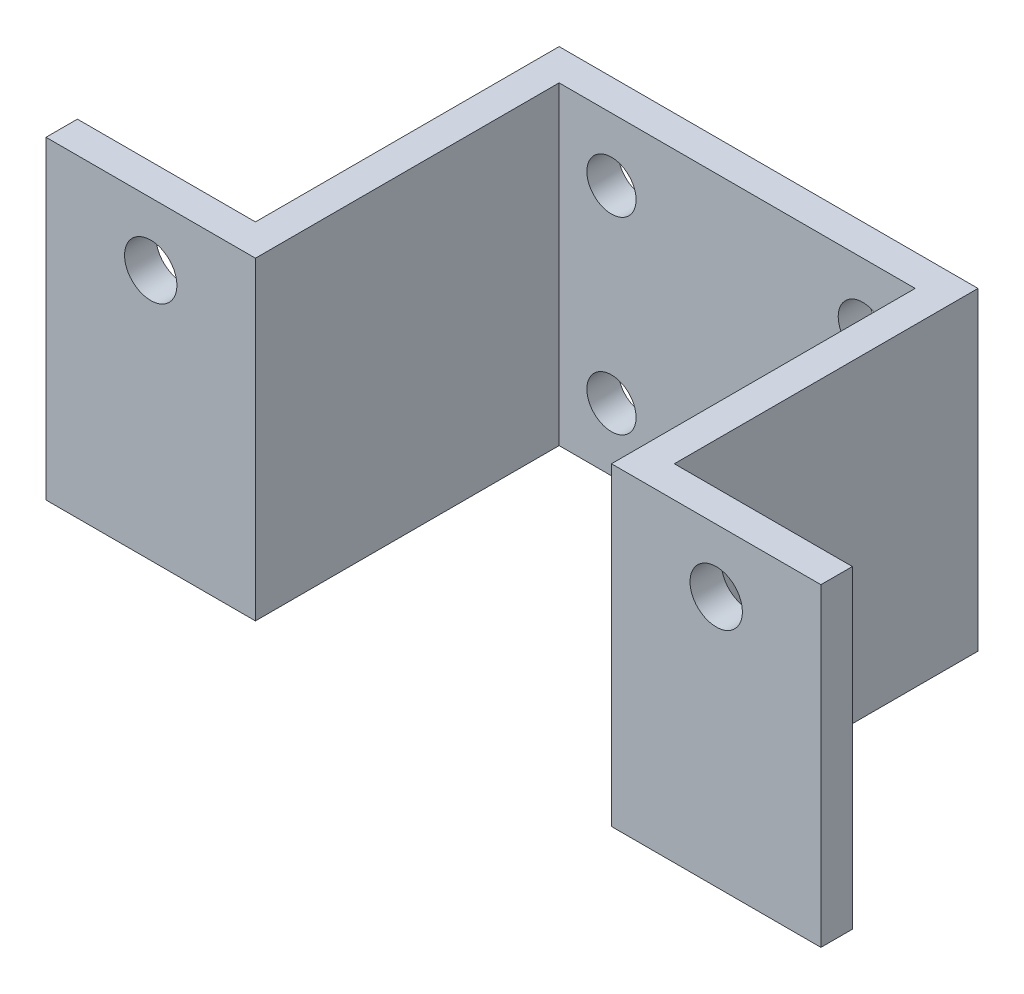
ISO-10303-21;
HEADER;
FILE_DESCRIPTION(('STEP AP214'),'2;1');
FILE_NAME('part.step','',(''),(''),'','','');
FILE_SCHEMA(('AUTOMOTIVE_DESIGN { 1 0 10303 214 1 1 1 1 }'));
ENDSEC;
DATA;
#1=APPLICATION_CONTEXT('core data for automotive mechanical design processes');
#2=APPLICATION_PROTOCOL_DEFINITION('international standard','automotive_design',2000,#1);
#3=PRODUCT_CONTEXT('',#1,'mechanical');
#4=PRODUCT('Part','Part','',(#3));
#5=PRODUCT_RELATED_PRODUCT_CATEGORY('part','',(#4));
#6=PRODUCT_DEFINITION_FORMATION('','',#4);
#7=PRODUCT_DEFINITION_CONTEXT('part definition',#1,'design');
#8=PRODUCT_DEFINITION('design','',#6,#7);
#9=PRODUCT_DEFINITION_SHAPE('','',#8);
#10=(LENGTH_UNIT() NAMED_UNIT(*) SI_UNIT(.MILLI.,.METRE.));
#11=(NAMED_UNIT(*) PLANE_ANGLE_UNIT() SI_UNIT($,.RADIAN.));
#12=(NAMED_UNIT(*) SI_UNIT($,.STERADIAN.) SOLID_ANGLE_UNIT());
#13=UNCERTAINTY_MEASURE_WITH_UNIT(LENGTH_MEASURE(1.E-05),#10,'distance_accuracy_value','');
#14=(GEOMETRIC_REPRESENTATION_CONTEXT(3) GLOBAL_UNCERTAINTY_ASSIGNED_CONTEXT((#13)) GLOBAL_UNIT_ASSIGNED_CONTEXT((#10,
#11,#12)) REPRESENTATION_CONTEXT('',''));
#15=CARTESIAN_POINT('',(0.,0.,0.));
#16=DIRECTION('',(0.,0.,1.));
#17=DIRECTION('',(1.,0.,0.));
#18=AXIS2_PLACEMENT_3D('',#15,#16,#17);
#19=CARTESIAN_POINT('',(-20.,30.,0.));
#20=DIRECTION('',(-1.,0.,0.));
#21=DIRECTION('',(0.,0.,1.));
#22=AXIS2_PLACEMENT_3D('',#19,#20,#21);
#23=PLANE('',#22);
#24=DIRECTION('',(0.,0.,-1.));
#25=VECTOR('',#24,1.);
#26=CARTESIAN_POINT('',(-20.,0.,0.));
#27=LINE('',#26,#25);
#28=CARTESIAN_POINT('',(-20.,0.,-3.));
#29=VERTEX_POINT('',#28);
#30=CARTESIAN_POINT('',(-20.,0.,-32.));
#31=VERTEX_POINT('',#30);
#32=EDGE_CURVE('E162',#29,#31,#27,.T.);
#33=ORIENTED_EDGE('',*,*,#32,.F.);
#34=DIRECTION('',(0.,-1.,0.));
#35=VECTOR('',#34,1.);
#36=CARTESIAN_POINT('',(-20.,30.,-3.));
#37=LINE('',#36,#35);
#38=CARTESIAN_POINT('',(-20.,30.,-3.));
#39=VERTEX_POINT('',#38);
#40=EDGE_CURVE('E11',#39,#29,#37,.T.);
#41=ORIENTED_EDGE('',*,*,#40,.F.);
#42=DIRECTION('',(0.,0.,-1.));
#43=VECTOR('',#42,1.);
#44=CARTESIAN_POINT('',(-20.,30.,0.));
#45=LINE('',#44,#43);
#46=CARTESIAN_POINT('',(-20.,30.,-32.));
#47=VERTEX_POINT('',#46);
#48=EDGE_CURVE('E193',#39,#47,#45,.T.);
#49=ORIENTED_EDGE('',*,*,#48,.T.);
#50=DIRECTION('',(0.,-1.,0.));
#51=VECTOR('',#50,1.);
#52=CARTESIAN_POINT('',(-20.,30.,-32.));
#53=LINE('',#52,#51);
#54=EDGE_CURVE('E59',#47,#31,#53,.T.);
#55=ORIENTED_EDGE('',*,*,#54,.T.);
#56=EDGE_LOOP('',(#33,#41,#49,#55));
#57=FACE_BOUND('',#56,.T.);
#58=ADVANCED_FACE('F42',(#57),#23,.T.);
#59=CARTESIAN_POINT('',(0.,30.,-3.));
#60=DIRECTION('',(0.,0.,1.));
#61=DIRECTION('',(1.,0.,0.));
#62=AXIS2_PLACEMENT_3D('',#59,#60,#61);
#63=PLANE('',#62);
#64=CARTESIAN_POINT('',(-27.,24.,-3.));
#65=DIRECTION('',(0.,0.,1.));
#66=DIRECTION('',(1.,0.,0.));
#67=AXIS2_PLACEMENT_3D('',#64,#65,#66);
#68=CIRCLE('',#67,2.5);
#69=CARTESIAN_POINT('',(-24.5,24.,-3.));
#70=VERTEX_POINT('',#69);
#71=EDGE_CURVE('E165',#70,#70,#68,.T.);
#72=ORIENTED_EDGE('',*,*,#71,.T.);
#73=EDGE_LOOP('',(#72));
#74=FACE_BOUND('',#73,.T.);
#75=DIRECTION('',(-1.,0.,0.));
#76=VECTOR('',#75,1.);
#77=CARTESIAN_POINT('',(0.,0.,-3.));
#78=LINE('',#77,#76);
#79=CARTESIAN_POINT('',(-37.,0.,-3.));
#80=VERTEX_POINT('',#79);
#81=EDGE_CURVE('E164',#29,#80,#78,.T.);
#82=ORIENTED_EDGE('',*,*,#81,.T.);
#83=DIRECTION('',(0.,-1.,0.));
#84=VECTOR('',#83,1.);
#85=CARTESIAN_POINT('',(-37.,30.,-3.));
#86=LINE('',#85,#84);
#87=CARTESIAN_POINT('',(-37.,30.,-3.));
#88=VERTEX_POINT('',#87);
#89=EDGE_CURVE('E51',#88,#80,#86,.T.);
#90=ORIENTED_EDGE('',*,*,#89,.F.);
#91=DIRECTION('',(-1.,0.,0.));
#92=VECTOR('',#91,1.);
#93=CARTESIAN_POINT('',(0.,30.,-3.));
#94=LINE('',#93,#92);
#95=EDGE_CURVE('E232',#39,#88,#94,.T.);
#96=ORIENTED_EDGE('',*,*,#95,.F.);
#97=ORIENTED_EDGE('',*,*,#40,.T.);
#98=EDGE_LOOP('',(#82,#90,#96,#97));
#99=FACE_BOUND('',#98,.T.);
#100=ADVANCED_FACE('F220',(#74,#99),#63,.F.);
#101=CARTESIAN_POINT('',(-37.,30.,0.));
#102=DIRECTION('',(-1.,0.,0.));
#103=DIRECTION('',(0.,0.,1.));
#104=AXIS2_PLACEMENT_3D('',#101,#102,#103);
#105=PLANE('',#104);
#106=DIRECTION('',(0.,0.,-1.));
#107=VECTOR('',#106,1.);
#108=CARTESIAN_POINT('',(-37.,0.,0.));
#109=LINE('',#108,#107);
#110=CARTESIAN_POINT('',(-37.,0.,0.));
#111=VERTEX_POINT('',#110);
#112=EDGE_CURVE('E168',#111,#80,#109,.T.);
#113=ORIENTED_EDGE('',*,*,#112,.F.);
#114=DIRECTION('',(0.,-1.,0.));
#115=VECTOR('',#114,1.);
#116=CARTESIAN_POINT('',(-37.,30.,0.));
#117=LINE('',#116,#115);
#118=CARTESIAN_POINT('',(-37.,30.,0.));
#119=VERTEX_POINT('',#118);
#120=EDGE_CURVE('E209',#119,#111,#117,.T.);
#121=ORIENTED_EDGE('',*,*,#120,.F.);
#122=DIRECTION('',(0.,0.,-1.));
#123=VECTOR('',#122,1.);
#124=CARTESIAN_POINT('',(-37.,30.,0.));
#125=LINE('',#124,#123);
#126=EDGE_CURVE('E217',#119,#88,#125,.T.);
#127=ORIENTED_EDGE('',*,*,#126,.T.);
#128=ORIENTED_EDGE('',*,*,#89,.T.);
#129=EDGE_LOOP('',(#113,#121,#127,#128));
#130=FACE_BOUND('',#129,.T.);
#131=ADVANCED_FACE('F215',(#130),#105,.T.);
#132=CARTESIAN_POINT('',(0.,30.,0.));
#133=DIRECTION('',(0.,0.,1.));
#134=DIRECTION('',(1.,0.,0.));
#135=AXIS2_PLACEMENT_3D('',#132,#133,#134);
#136=PLANE('',#135);
#137=CARTESIAN_POINT('',(-27.,24.,0.));
#138=DIRECTION('',(0.,0.,1.));
#139=DIRECTION('',(1.,0.,0.));
#140=AXIS2_PLACEMENT_3D('',#137,#138,#139);
#141=CIRCLE('',#140,2.5);
#142=CARTESIAN_POINT('',(-24.5,24.,0.));
#143=VERTEX_POINT('',#142);
#144=EDGE_CURVE('E304',#143,#143,#141,.T.);
#145=ORIENTED_EDGE('',*,*,#144,.F.);
#146=EDGE_LOOP('',(#145));
#147=FACE_BOUND('',#146,.T.);
#148=DIRECTION('',(-1.,0.,0.));
#149=VECTOR('',#148,1.);
#150=CARTESIAN_POINT('',(0.,0.,0.));
#151=LINE('',#150,#149);
#152=CARTESIAN_POINT('',(-17.,0.,0.));
#153=VERTEX_POINT('',#152);
#154=EDGE_CURVE('E171',#153,#111,#151,.T.);
#155=ORIENTED_EDGE('',*,*,#154,.F.);
#156=DIRECTION('',(0.,-1.,0.));
#157=VECTOR('',#156,1.);
#158=CARTESIAN_POINT('',(-17.,30.,0.));
#159=LINE('',#158,#157);
#160=CARTESIAN_POINT('',(-17.,30.,0.));
#161=VERTEX_POINT('',#160);
#162=EDGE_CURVE('E207',#161,#153,#159,.T.);
#163=ORIENTED_EDGE('',*,*,#162,.F.);
#164=DIRECTION('',(-1.,0.,0.));
#165=VECTOR('',#164,1.);
#166=CARTESIAN_POINT('',(0.,30.,0.));
#167=LINE('',#166,#165);
#168=EDGE_CURVE('E231',#161,#119,#167,.T.);
#169=ORIENTED_EDGE('',*,*,#168,.T.);
#170=ORIENTED_EDGE('',*,*,#120,.T.);
#171=EDGE_LOOP('',(#155,#163,#169,#170));
#172=FACE_BOUND('',#171,.T.);
#173=ADVANCED_FACE('F227',(#147,#172),#136,.T.);
#174=CARTESIAN_POINT('',(-17.,30.,0.));
#175=DIRECTION('',(-1.,0.,0.));
#176=DIRECTION('',(0.,0.,1.));
#177=AXIS2_PLACEMENT_3D('',#174,#175,#176);
#178=PLANE('',#177);
#179=DIRECTION('',(0.,0.,-1.));
#180=VECTOR('',#179,1.);
#181=CARTESIAN_POINT('',(-17.,0.,0.));
#182=LINE('',#181,#180);
#183=CARTESIAN_POINT('',(-17.,0.,-29.));
#184=VERTEX_POINT('',#183);
#185=EDGE_CURVE('E174',#153,#184,#182,.T.);
#186=ORIENTED_EDGE('',*,*,#185,.T.);
#187=DIRECTION('',(0.,-1.,0.));
#188=VECTOR('',#187,1.);
#189=CARTESIAN_POINT('',(-17.,30.,-29.));
#190=LINE('',#189,#188);
#191=CARTESIAN_POINT('',(-17.,30.,-29.));
#192=VERTEX_POINT('',#191);
#193=EDGE_CURVE('E204',#192,#184,#190,.T.);
#194=ORIENTED_EDGE('',*,*,#193,.F.);
#195=DIRECTION('',(0.,0.,-1.));
#196=VECTOR('',#195,1.);
#197=CARTESIAN_POINT('',(-17.,30.,0.));
#198=LINE('',#197,#196);
#199=EDGE_CURVE('E234',#161,#192,#198,.T.);
#200=ORIENTED_EDGE('',*,*,#199,.F.);
#201=ORIENTED_EDGE('',*,*,#162,.T.);
#202=EDGE_LOOP('',(#186,#194,#200,#201));
#203=FACE_BOUND('',#202,.T.);
#204=ADVANCED_FACE('F279',(#203),#178,.F.);
#205=CARTESIAN_POINT('',(0.,30.,-29.));
#206=DIRECTION('',(0.,0.,-1.));
#207=DIRECTION('',(-1.,0.,0.));
#208=AXIS2_PLACEMENT_3D('',#205,#206,#207);
#209=PLANE('',#208);
#210=CARTESIAN_POINT('',(12.,24.,-29.));
#211=DIRECTION('',(0.,0.,-1.));
#212=DIRECTION('',(-1.,0.,0.));
#213=AXIS2_PLACEMENT_3D('',#210,#211,#212);
#214=CIRCLE('',#213,2.35000000000001);
#215=CARTESIAN_POINT('',(9.64999999999999,24.,-29.));
#216=VERTEX_POINT('',#215);
#217=EDGE_CURVE('E312',#216,#216,#214,.T.);
#218=ORIENTED_EDGE('',*,*,#217,.T.);
#219=EDGE_LOOP('',(#218));
#220=FACE_BOUND('',#219,.T.);
#221=CARTESIAN_POINT('',(-12.,24.,-29.));
#222=DIRECTION('',(0.,0.,-1.));
#223=DIRECTION('',(-1.,0.,0.));
#224=AXIS2_PLACEMENT_3D('',#221,#222,#223);
#225=CIRCLE('',#224,2.35);
#226=CARTESIAN_POINT('',(-14.35,24.,-29.));
#227=VERTEX_POINT('',#226);
#228=EDGE_CURVE('E317',#227,#227,#225,.T.);
#229=ORIENTED_EDGE('',*,*,#228,.T.);
#230=EDGE_LOOP('',(#229));
#231=FACE_BOUND('',#230,.T.);
#232=CARTESIAN_POINT('',(-12.,5.99999999999999,-29.));
#233=DIRECTION('',(0.,0.,-1.));
#234=DIRECTION('',(-1.,0.,0.));
#235=AXIS2_PLACEMENT_3D('',#232,#233,#234);
#236=CIRCLE('',#235,2.35);
#237=CARTESIAN_POINT('',(-14.35,5.99999999999999,-29.));
#238=VERTEX_POINT('',#237);
#239=EDGE_CURVE('E320',#238,#238,#236,.T.);
#240=ORIENTED_EDGE('',*,*,#239,.T.);
#241=EDGE_LOOP('',(#240));
#242=FACE_BOUND('',#241,.T.);
#243=CARTESIAN_POINT('',(12.,6.00000000000001,-29.));
#244=DIRECTION('',(0.,0.,-1.));
#245=DIRECTION('',(-1.,0.,0.));
#246=AXIS2_PLACEMENT_3D('',#243,#244,#245);
#247=CIRCLE('',#246,2.35);
#248=CARTESIAN_POINT('',(9.65000000000001,6.00000000000001,-29.));
#249=VERTEX_POINT('',#248);
#250=EDGE_CURVE('E323',#249,#249,#247,.T.);
#251=ORIENTED_EDGE('',*,*,#250,.T.);
#252=EDGE_LOOP('',(#251));
#253=FACE_BOUND('',#252,.T.);
#254=DIRECTION('',(1.,0.,0.));
#255=VECTOR('',#254,1.);
#256=CARTESIAN_POINT('',(0.,0.,-29.));
#257=LINE('',#256,#255);
#258=CARTESIAN_POINT('',(17.,0.,-29.));
#259=VERTEX_POINT('',#258);
#260=EDGE_CURVE('E176',#184,#259,#257,.T.);
#261=ORIENTED_EDGE('',*,*,#260,.T.);
#262=DIRECTION('',(0.,-1.,0.));
#263=VECTOR('',#262,1.);
#264=CARTESIAN_POINT('',(17.,30.,-29.));
#265=LINE('',#264,#263);
#266=CARTESIAN_POINT('',(17.,30.,-29.));
#267=VERTEX_POINT('',#266);
#268=EDGE_CURVE('E202',#267,#259,#265,.T.);
#269=ORIENTED_EDGE('',*,*,#268,.F.);
#270=DIRECTION('',(1.,0.,0.));
#271=VECTOR('',#270,1.);
#272=CARTESIAN_POINT('',(0.,30.,-29.));
#273=LINE('',#272,#271);
#274=EDGE_CURVE('E240',#192,#267,#273,.T.);
#275=ORIENTED_EDGE('',*,*,#274,.F.);
#276=ORIENTED_EDGE('',*,*,#193,.T.);
#277=EDGE_LOOP('',(#261,#269,#275,#276));
#278=FACE_BOUND('',#277,.T.);
#279=ADVANCED_FACE('F283',(#220,#231,#242,#253,#278),#209,.F.);
#280=CARTESIAN_POINT('',(17.,30.,0.));
#281=DIRECTION('',(-1.,0.,0.));
#282=DIRECTION('',(0.,0.,1.));
#283=AXIS2_PLACEMENT_3D('',#280,#281,#282);
#284=PLANE('',#283);
#285=DIRECTION('',(0.,0.,-1.));
#286=VECTOR('',#285,1.);
#287=CARTESIAN_POINT('',(17.,0.,0.));
#288=LINE('',#287,#286);
#289=CARTESIAN_POINT('',(17.,0.,0.));
#290=VERTEX_POINT('',#289);
#291=EDGE_CURVE('E179',#290,#259,#288,.T.);
#292=ORIENTED_EDGE('',*,*,#291,.F.);
#293=DIRECTION('',(0.,-1.,0.));
#294=VECTOR('',#293,1.);
#295=CARTESIAN_POINT('',(17.,30.,0.));
#296=LINE('',#295,#294);
#297=CARTESIAN_POINT('',(17.,30.,0.));
#298=VERTEX_POINT('',#297);
#299=EDGE_CURVE('E200',#298,#290,#296,.T.);
#300=ORIENTED_EDGE('',*,*,#299,.F.);
#301=DIRECTION('',(0.,0.,-1.));
#302=VECTOR('',#301,1.);
#303=CARTESIAN_POINT('',(17.,30.,0.));
#304=LINE('',#303,#302);
#305=EDGE_CURVE('E242',#298,#267,#304,.T.);
#306=ORIENTED_EDGE('',*,*,#305,.T.);
#307=ORIENTED_EDGE('',*,*,#268,.T.);
#308=EDGE_LOOP('',(#292,#300,#306,#307));
#309=FACE_BOUND('',#308,.T.);
#310=ADVANCED_FACE('F287',(#309),#284,.T.);
#311=CARTESIAN_POINT('',(0.,30.,0.));
#312=DIRECTION('',(0.,0.,-1.));
#313=DIRECTION('',(-1.,0.,0.));
#314=AXIS2_PLACEMENT_3D('',#311,#312,#313);
#315=PLANE('',#314);
#316=CARTESIAN_POINT('',(27.,24.,0.));
#317=DIRECTION('',(0.,0.,1.));
#318=DIRECTION('',(1.,0.,0.));
#319=AXIS2_PLACEMENT_3D('',#316,#317,#318);
#320=CIRCLE('',#319,2.5);
#321=CARTESIAN_POINT('',(29.5,24.,0.));
#322=VERTEX_POINT('',#321);
#323=EDGE_CURVE('E307',#322,#322,#320,.F.);
#324=ORIENTED_EDGE('',*,*,#323,.T.);
#325=EDGE_LOOP('',(#324));
#326=FACE_BOUND('',#325,.T.);
#327=DIRECTION('',(1.,0.,0.));
#328=VECTOR('',#327,1.);
#329=CARTESIAN_POINT('',(0.,0.,0.));
#330=LINE('',#329,#328);
#331=CARTESIAN_POINT('',(37.,0.,0.));
#332=VERTEX_POINT('',#331);
#333=EDGE_CURVE('E182',#290,#332,#330,.T.);
#334=ORIENTED_EDGE('',*,*,#333,.T.);
#335=DIRECTION('',(0.,-1.,0.));
#336=VECTOR('',#335,1.);
#337=CARTESIAN_POINT('',(37.,30.,0.));
#338=LINE('',#337,#336);
#339=CARTESIAN_POINT('',(37.,30.,0.));
#340=VERTEX_POINT('',#339);
#341=EDGE_CURVE('E197',#340,#332,#338,.T.);
#342=ORIENTED_EDGE('',*,*,#341,.F.);
#343=DIRECTION('',(1.,0.,0.));
#344=VECTOR('',#343,1.);
#345=CARTESIAN_POINT('',(0.,30.,0.));
#346=LINE('',#345,#344);
#347=EDGE_CURVE('E157',#298,#340,#346,.T.);
#348=ORIENTED_EDGE('',*,*,#347,.F.);
#349=ORIENTED_EDGE('',*,*,#299,.T.);
#350=EDGE_LOOP('',(#334,#342,#348,#349));
#351=FACE_BOUND('',#350,.T.);
#352=ADVANCED_FACE('F248',(#326,#351),#315,.F.);
#353=CARTESIAN_POINT('',(37.,30.,0.));
#354=DIRECTION('',(-1.,0.,0.));
#355=DIRECTION('',(0.,0.,1.));
#356=AXIS2_PLACEMENT_3D('',#353,#354,#355);
#357=PLANE('',#356);
#358=DIRECTION('',(0.,0.,-1.));
#359=VECTOR('',#358,1.);
#360=CARTESIAN_POINT('',(37.,0.,0.));
#361=LINE('',#360,#359);
#362=CARTESIAN_POINT('',(37.,0.,-3.));
#363=VERTEX_POINT('',#362);
#364=EDGE_CURVE('E184',#332,#363,#361,.T.);
#365=ORIENTED_EDGE('',*,*,#364,.T.);
#366=DIRECTION('',(0.,-1.,0.));
#367=VECTOR('',#366,1.);
#368=CARTESIAN_POINT('',(37.,30.,-3.));
#369=LINE('',#368,#367);
#370=CARTESIAN_POINT('',(37.,30.,-3.));
#371=VERTEX_POINT('',#370);
#372=EDGE_CURVE('E143',#371,#363,#369,.T.);
#373=ORIENTED_EDGE('',*,*,#372,.F.);
#374=DIRECTION('',(0.,0.,-1.));
#375=VECTOR('',#374,1.);
#376=CARTESIAN_POINT('',(37.,30.,0.));
#377=LINE('',#376,#375);
#378=EDGE_CURVE('E154',#340,#371,#377,.T.);
#379=ORIENTED_EDGE('',*,*,#378,.F.);
#380=ORIENTED_EDGE('',*,*,#341,.T.);
#381=EDGE_LOOP('',(#365,#373,#379,#380));
#382=FACE_BOUND('',#381,.T.);
#383=ADVANCED_FACE('F252',(#382),#357,.F.);
#384=CARTESIAN_POINT('',(0.,30.,-3.));
#385=DIRECTION('',(0.,0.,-1.));
#386=DIRECTION('',(-1.,0.,0.));
#387=AXIS2_PLACEMENT_3D('',#384,#385,#386);
#388=PLANE('',#387);
#389=CARTESIAN_POINT('',(27.,24.,-3.));
#390=DIRECTION('',(0.,0.,-1.));
#391=DIRECTION('',(-1.,0.,0.));
#392=AXIS2_PLACEMENT_3D('',#389,#390,#391);
#393=CIRCLE('',#392,2.5);
#394=CARTESIAN_POINT('',(24.5,24.,-3.));
#395=VERTEX_POINT('',#394);
#396=EDGE_CURVE('E45',#395,#395,#393,.F.);
#397=ORIENTED_EDGE('',*,*,#396,.T.);
#398=EDGE_LOOP('',(#397));
#399=FACE_BOUND('',#398,.T.);
#400=DIRECTION('',(1.,0.,0.));
#401=VECTOR('',#400,1.);
#402=CARTESIAN_POINT('',(0.,0.,-3.));
#403=LINE('',#402,#401);
#404=CARTESIAN_POINT('',(20.,0.,-3.));
#405=VERTEX_POINT('',#404);
#406=EDGE_CURVE('E140',#405,#363,#403,.T.);
#407=ORIENTED_EDGE('',*,*,#406,.F.);
#408=DIRECTION('',(0.,-1.,0.));
#409=VECTOR('',#408,1.);
#410=CARTESIAN_POINT('',(20.,30.,-3.));
#411=LINE('',#410,#409);
#412=CARTESIAN_POINT('',(20.,30.,-3.));
#413=VERTEX_POINT('',#412);
#414=EDGE_CURVE('E134',#413,#405,#411,.T.);
#415=ORIENTED_EDGE('',*,*,#414,.F.);
#416=DIRECTION('',(1.,0.,0.));
#417=VECTOR('',#416,1.);
#418=CARTESIAN_POINT('',(0.,30.,-3.));
#419=LINE('',#418,#417);
#420=EDGE_CURVE('E138',#413,#371,#419,.T.);
#421=ORIENTED_EDGE('',*,*,#420,.T.);
#422=ORIENTED_EDGE('',*,*,#372,.T.);
#423=EDGE_LOOP('',(#407,#415,#421,#422));
#424=FACE_BOUND('',#423,.T.);
#425=ADVANCED_FACE('F136',(#399,#424),#388,.T.);
#426=CARTESIAN_POINT('',(20.,30.,0.));
#427=DIRECTION('',(-1.,0.,0.));
#428=DIRECTION('',(0.,0.,1.));
#429=AXIS2_PLACEMENT_3D('',#426,#427,#428);
#430=PLANE('',#429);
#431=DIRECTION('',(0.,0.,-1.));
#432=VECTOR('',#431,1.);
#433=CARTESIAN_POINT('',(20.,0.,0.));
#434=LINE('',#433,#432);
#435=CARTESIAN_POINT('',(20.,0.,-32.));
#436=VERTEX_POINT('',#435);
#437=EDGE_CURVE('E188',#405,#436,#434,.T.);
#438=ORIENTED_EDGE('',*,*,#437,.T.);
#439=DIRECTION('',(0.,-1.,0.));
#440=VECTOR('',#439,1.);
#441=CARTESIAN_POINT('',(20.,30.,-32.));
#442=LINE('',#441,#440);
#443=CARTESIAN_POINT('',(20.,30.,-32.));
#444=VERTEX_POINT('',#443);
#445=EDGE_CURVE('E97',#444,#436,#442,.T.);
#446=ORIENTED_EDGE('',*,*,#445,.F.);
#447=DIRECTION('',(0.,0.,-1.));
#448=VECTOR('',#447,1.);
#449=CARTESIAN_POINT('',(20.,30.,0.));
#450=LINE('',#449,#448);
#451=EDGE_CURVE('E145',#413,#444,#450,.T.);
#452=ORIENTED_EDGE('',*,*,#451,.F.);
#453=ORIENTED_EDGE('',*,*,#414,.T.);
#454=EDGE_LOOP('',(#438,#446,#452,#453));
#455=FACE_BOUND('',#454,.T.);
#456=ADVANCED_FACE('F146',(#455),#430,.F.);
#457=CARTESIAN_POINT('',(0.,30.,-32.));
#458=DIRECTION('',(0.,0.,-1.));
#459=DIRECTION('',(-1.,0.,0.));
#460=AXIS2_PLACEMENT_3D('',#457,#458,#459);
#461=PLANE('',#460);
#462=CARTESIAN_POINT('',(12.,24.,-32.));
#463=DIRECTION('',(0.,0.,-1.));
#464=DIRECTION('',(-1.,0.,0.));
#465=AXIS2_PLACEMENT_3D('',#462,#463,#464);
#466=CIRCLE('',#465,2.35000000000001);
#467=CARTESIAN_POINT('',(9.64999999999999,24.,-32.));
#468=VERTEX_POINT('',#467);
#469=EDGE_CURVE('E330',#468,#468,#466,.T.);
#470=ORIENTED_EDGE('',*,*,#469,.F.);
#471=EDGE_LOOP('',(#470));
#472=FACE_BOUND('',#471,.T.);
#473=CARTESIAN_POINT('',(-12.,24.,-32.));
#474=DIRECTION('',(0.,0.,-1.));
#475=DIRECTION('',(-1.,0.,0.));
#476=AXIS2_PLACEMENT_3D('',#473,#474,#475);
#477=CIRCLE('',#476,2.35);
#478=CARTESIAN_POINT('',(-14.35,24.,-32.));
#479=VERTEX_POINT('',#478);
#480=EDGE_CURVE('E333',#479,#479,#477,.T.);
#481=ORIENTED_EDGE('',*,*,#480,.F.);
#482=EDGE_LOOP('',(#481));
#483=FACE_BOUND('',#482,.T.);
#484=CARTESIAN_POINT('',(-12.,5.99999999999999,-32.));
#485=DIRECTION('',(0.,0.,-1.));
#486=DIRECTION('',(-1.,0.,0.));
#487=AXIS2_PLACEMENT_3D('',#484,#485,#486);
#488=CIRCLE('',#487,2.35);
#489=CARTESIAN_POINT('',(-14.35,5.99999999999999,-32.));
#490=VERTEX_POINT('',#489);
#491=EDGE_CURVE('E329',#490,#490,#488,.T.);
#492=ORIENTED_EDGE('',*,*,#491,.F.);
#493=EDGE_LOOP('',(#492));
#494=FACE_BOUND('',#493,.T.);
#495=CARTESIAN_POINT('',(12.,6.00000000000001,-32.));
#496=DIRECTION('',(0.,0.,-1.));
#497=DIRECTION('',(-1.,0.,0.));
#498=AXIS2_PLACEMENT_3D('',#495,#496,#497);
#499=CIRCLE('',#498,2.35);
#500=CARTESIAN_POINT('',(9.65000000000001,6.00000000000001,-32.));
#501=VERTEX_POINT('',#500);
#502=EDGE_CURVE('E326',#501,#501,#499,.T.);
#503=ORIENTED_EDGE('',*,*,#502,.F.);
#504=EDGE_LOOP('',(#503));
#505=FACE_BOUND('',#504,.T.);
#506=DIRECTION('',(1.,0.,0.));
#507=VECTOR('',#506,1.);
#508=CARTESIAN_POINT('',(0.,0.,-32.));
#509=LINE('',#508,#507);
#510=EDGE_CURVE('E190',#31,#436,#509,.T.);
#511=ORIENTED_EDGE('',*,*,#510,.F.);
#512=ORIENTED_EDGE('',*,*,#54,.F.);
#513=DIRECTION('',(1.,0.,0.));
#514=VECTOR('',#513,1.);
#515=CARTESIAN_POINT('',(0.,30.,-32.));
#516=LINE('',#515,#514);
#517=EDGE_CURVE('E149',#47,#444,#516,.T.);
#518=ORIENTED_EDGE('',*,*,#517,.T.);
#519=ORIENTED_EDGE('',*,*,#445,.T.);
#520=EDGE_LOOP('',(#511,#512,#518,#519));
#521=FACE_BOUND('',#520,.T.);
#522=ADVANCED_FACE('F253',(#472,#483,#494,#505,#521),#461,.T.);
#523=CARTESIAN_POINT('',(0.,30.,0.));
#524=DIRECTION('',(0.,1.,0.));
#525=DIRECTION('',(0.,0.,1.));
#526=AXIS2_PLACEMENT_3D('',#523,#524,#525);
#527=PLANE('',#526);
#528=ORIENTED_EDGE('',*,*,#48,.F.);
#529=ORIENTED_EDGE('',*,*,#95,.T.);
#530=ORIENTED_EDGE('',*,*,#126,.F.);
#531=ORIENTED_EDGE('',*,*,#168,.F.);
#532=ORIENTED_EDGE('',*,*,#199,.T.);
#533=ORIENTED_EDGE('',*,*,#274,.T.);
#534=ORIENTED_EDGE('',*,*,#305,.F.);
#535=ORIENTED_EDGE('',*,*,#347,.T.);
#536=ORIENTED_EDGE('',*,*,#378,.T.);
#537=ORIENTED_EDGE('',*,*,#420,.F.);
#538=ORIENTED_EDGE('',*,*,#451,.T.);
#539=ORIENTED_EDGE('',*,*,#517,.F.);
#540=EDGE_LOOP('',(#528,#529,#530,#531,#532,#533,#534,#535,#536,#537,#538,#539));
#541=FACE_BOUND('',#540,.T.);
#542=ADVANCED_FACE('F152',(#541),#527,.T.);
#543=CARTESIAN_POINT('',(0.,0.,0.));
#544=DIRECTION('',(0.,1.,0.));
#545=DIRECTION('',(0.,0.,1.));
#546=AXIS2_PLACEMENT_3D('',#543,#544,#545);
#547=PLANE('',#546);
#548=ORIENTED_EDGE('',*,*,#32,.T.);
#549=ORIENTED_EDGE('',*,*,#510,.T.);
#550=ORIENTED_EDGE('',*,*,#437,.F.);
#551=ORIENTED_EDGE('',*,*,#406,.T.);
#552=ORIENTED_EDGE('',*,*,#364,.F.);
#553=ORIENTED_EDGE('',*,*,#333,.F.);
#554=ORIENTED_EDGE('',*,*,#291,.T.);
#555=ORIENTED_EDGE('',*,*,#260,.F.);
#556=ORIENTED_EDGE('',*,*,#185,.F.);
#557=ORIENTED_EDGE('',*,*,#154,.T.);
#558=ORIENTED_EDGE('',*,*,#112,.T.);
#559=ORIENTED_EDGE('',*,*,#81,.F.);
#560=EDGE_LOOP('',(#548,#549,#550,#551,#552,#553,#554,#555,#556,#557,#558,#559));
#561=FACE_BOUND('',#560,.T.);
#562=ADVANCED_FACE('F222',(#561),#547,.F.);
#563=CARTESIAN_POINT('',(27.,24.,-30.));
#564=DIRECTION('',(0.,0.,1.));
#565=DIRECTION('',(1.,0.,0.));
#566=AXIS2_PLACEMENT_3D('',#563,#564,#565);
#567=CYLINDRICAL_SURFACE('',#566,2.5);
#568=ORIENTED_EDGE('',*,*,#396,.F.);
#569=EDGE_LOOP('',(#568));
#570=FACE_BOUND('',#569,.T.);
#571=ORIENTED_EDGE('',*,*,#323,.F.);
#572=EDGE_LOOP('',(#571));
#573=FACE_BOUND('',#572,.T.);
#574=ADVANCED_FACE('F363',(#570,#573),#567,.F.);
#575=CARTESIAN_POINT('',(-27.,24.,-30.));
#576=DIRECTION('',(0.,0.,1.));
#577=DIRECTION('',(1.,0.,0.));
#578=AXIS2_PLACEMENT_3D('',#575,#576,#577);
#579=CYLINDRICAL_SURFACE('',#578,2.5);
#580=ORIENTED_EDGE('',*,*,#144,.T.);
#581=EDGE_LOOP('',(#580));
#582=FACE_BOUND('',#581,.T.);
#583=ORIENTED_EDGE('',*,*,#71,.F.);
#584=EDGE_LOOP('',(#583));
#585=FACE_BOUND('',#584,.T.);
#586=ADVANCED_FACE('F348',(#582,#585),#579,.F.);
#587=CARTESIAN_POINT('',(12.,6.00000000000001,-2.));
#588=DIRECTION('',(0.,0.,-1.));
#589=DIRECTION('',(-1.,0.,0.));
#590=AXIS2_PLACEMENT_3D('',#587,#588,#589);
#591=CYLINDRICAL_SURFACE('',#590,2.35);
#592=ORIENTED_EDGE('',*,*,#502,.T.);
#593=EDGE_LOOP('',(#592));
#594=FACE_BOUND('',#593,.T.);
#595=ORIENTED_EDGE('',*,*,#250,.F.);
#596=EDGE_LOOP('',(#595));
#597=FACE_BOUND('',#596,.T.);
#598=ADVANCED_FACE('F345',(#594,#597),#591,.F.);
#599=CARTESIAN_POINT('',(-12.,5.99999999999999,-2.));
#600=DIRECTION('',(0.,0.,-1.));
#601=DIRECTION('',(-1.,0.,0.));
#602=AXIS2_PLACEMENT_3D('',#599,#600,#601);
#603=CYLINDRICAL_SURFACE('',#602,2.35);
#604=ORIENTED_EDGE('',*,*,#491,.T.);
#605=EDGE_LOOP('',(#604));
#606=FACE_BOUND('',#605,.T.);
#607=ORIENTED_EDGE('',*,*,#239,.F.);
#608=EDGE_LOOP('',(#607));
#609=FACE_BOUND('',#608,.T.);
#610=ADVANCED_FACE('F339',(#606,#609),#603,.F.);
#611=CARTESIAN_POINT('',(-12.,24.,-2.));
#612=DIRECTION('',(0.,0.,-1.));
#613=DIRECTION('',(-1.,0.,0.));
#614=AXIS2_PLACEMENT_3D('',#611,#612,#613);
#615=CYLINDRICAL_SURFACE('',#614,2.35);
#616=ORIENTED_EDGE('',*,*,#480,.T.);
#617=EDGE_LOOP('',(#616));
#618=FACE_BOUND('',#617,.T.);
#619=ORIENTED_EDGE('',*,*,#228,.F.);
#620=EDGE_LOOP('',(#619));
#621=FACE_BOUND('',#620,.T.);
#622=ADVANCED_FACE('F361',(#618,#621),#615,.F.);
#623=CARTESIAN_POINT('',(12.,24.,-2.));
#624=DIRECTION('',(0.,0.,-1.));
#625=DIRECTION('',(-1.,0.,0.));
#626=AXIS2_PLACEMENT_3D('',#623,#624,#625);
#627=CYLINDRICAL_SURFACE('',#626,2.35000000000001);
#628=ORIENTED_EDGE('',*,*,#469,.T.);
#629=EDGE_LOOP('',(#628));
#630=FACE_BOUND('',#629,.T.);
#631=ORIENTED_EDGE('',*,*,#217,.F.);
#632=EDGE_LOOP('',(#631));
#633=FACE_BOUND('',#632,.T.);
#634=ADVANCED_FACE('F366',(#630,#633),#627,.F.);
#635=CLOSED_SHELL('',(#58,#100,#131,#173,#204,#279,#310,#352,#383,#425,#456,#522,#542,#562,#574,
#586,#598,#610,#622,#634));
#636=MANIFOLD_SOLID_BREP('B2',#635);
#637=ADVANCED_BREP_SHAPE_REPRESENTATION('',(#18,#636),#14);
#638=SHAPE_DEFINITION_REPRESENTATION(#9,#637);
ENDSEC;
END-ISO-10303-21;
